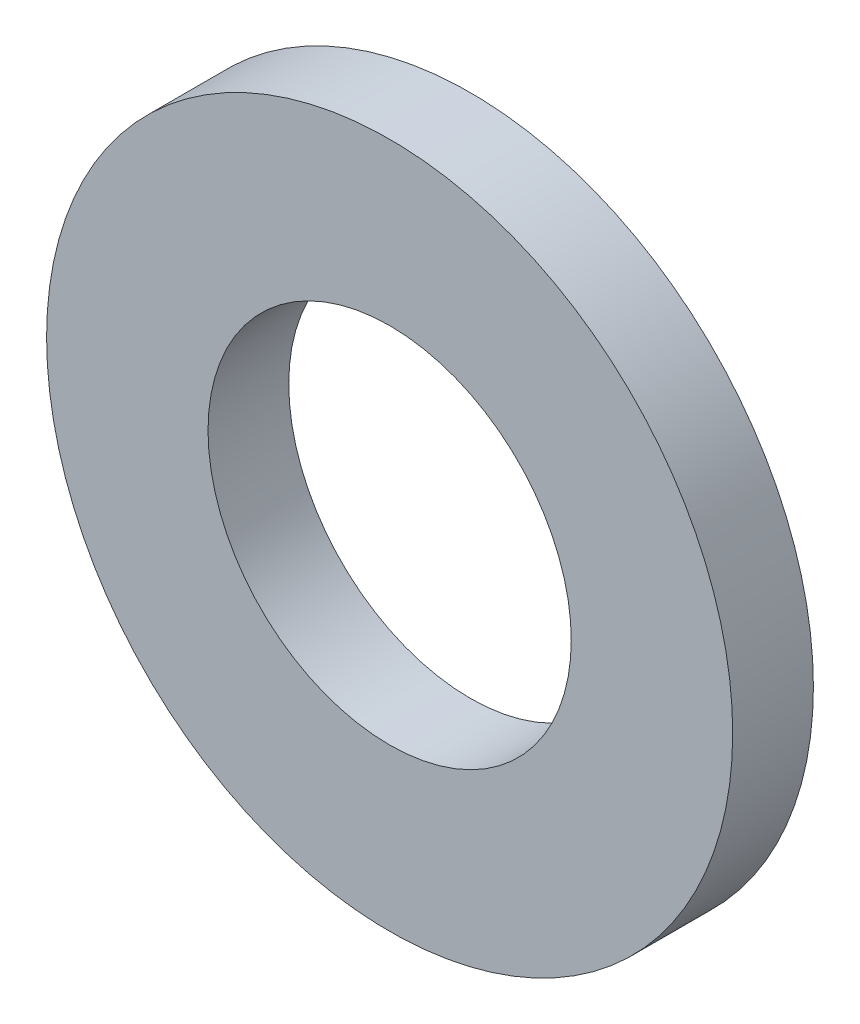
ISO-10303-21;
HEADER;
FILE_DESCRIPTION(('STEP AP214'),'2;1');
FILE_NAME('part.step','',(''),(''),'','','');
FILE_SCHEMA(('AUTOMOTIVE_DESIGN { 1 0 10303 214 1 1 1 1 }'));
ENDSEC;
DATA;
#1=APPLICATION_CONTEXT('core data for automotive mechanical design processes');
#2=APPLICATION_PROTOCOL_DEFINITION('international standard','automotive_design',2000,#1);
#3=PRODUCT_CONTEXT('',#1,'mechanical');
#4=PRODUCT('Part','Part','',(#3));
#5=PRODUCT_RELATED_PRODUCT_CATEGORY('part','',(#4));
#6=PRODUCT_DEFINITION_FORMATION('','',#4);
#7=PRODUCT_DEFINITION_CONTEXT('part definition',#1,'design');
#8=PRODUCT_DEFINITION('design','',#6,#7);
#9=PRODUCT_DEFINITION_SHAPE('','',#8);
#10=(LENGTH_UNIT() NAMED_UNIT(*) SI_UNIT(.MILLI.,.METRE.));
#11=(NAMED_UNIT(*) PLANE_ANGLE_UNIT() SI_UNIT($,.RADIAN.));
#12=(NAMED_UNIT(*) SI_UNIT($,.STERADIAN.) SOLID_ANGLE_UNIT());
#13=UNCERTAINTY_MEASURE_WITH_UNIT(LENGTH_MEASURE(1.E-05),#10,'distance_accuracy_value','');
#14=(GEOMETRIC_REPRESENTATION_CONTEXT(3) GLOBAL_UNCERTAINTY_ASSIGNED_CONTEXT((#13)) GLOBAL_UNIT_ASSIGNED_CONTEXT((#10,
#11,#12)) REPRESENTATION_CONTEXT('',''));
#15=CARTESIAN_POINT('',(0.,0.,0.));
#16=DIRECTION('',(0.,0.,1.));
#17=DIRECTION('',(1.,0.,0.));
#18=AXIS2_PLACEMENT_3D('',#15,#16,#17);
#19=CARTESIAN_POINT('',(0.,0.,10.));
#20=DIRECTION('',(0.,0.,1.));
#21=DIRECTION('',(1.,0.,0.));
#22=AXIS2_PLACEMENT_3D('',#19,#20,#21);
#23=PLANE('',#22);
#24=CARTESIAN_POINT('',(0.,0.,10.));
#25=DIRECTION('',(0.,0.,1.));
#26=DIRECTION('',(1.,0.,0.));
#27=AXIS2_PLACEMENT_3D('',#24,#25,#26);
#28=CIRCLE('',#27,42.5);
#29=CARTESIAN_POINT('',(42.5,0.,10.));
#30=VERTEX_POINT('',#29);
#31=EDGE_CURVE('E12',#30,#30,#28,.T.);
#32=ORIENTED_EDGE('',*,*,#31,.T.);
#33=EDGE_LOOP('',(#32));
#34=FACE_BOUND('',#33,.T.);
#35=CARTESIAN_POINT('',(0.,0.,10.));
#36=DIRECTION('',(0.,0.,1.));
#37=DIRECTION('',(1.,0.,0.));
#38=AXIS2_PLACEMENT_3D('',#35,#36,#37);
#39=CIRCLE('',#38,22.5);
#40=CARTESIAN_POINT('',(22.5,0.,10.));
#41=VERTEX_POINT('',#40);
#42=EDGE_CURVE('E51',#41,#41,#39,.T.);
#43=ORIENTED_EDGE('',*,*,#42,.F.);
#44=EDGE_LOOP('',(#43));
#45=FACE_BOUND('',#44,.T.);
#46=ADVANCED_FACE('F40',(#34,#45),#23,.T.);
#47=CARTESIAN_POINT('',(0.,0.,0.));
#48=DIRECTION('',(0.,0.,1.));
#49=DIRECTION('',(1.,0.,0.));
#50=AXIS2_PLACEMENT_3D('',#47,#48,#49);
#51=PLANE('',#50);
#52=CARTESIAN_POINT('',(0.,0.,0.));
#53=DIRECTION('',(0.,0.,1.));
#54=DIRECTION('',(1.,0.,0.));
#55=AXIS2_PLACEMENT_3D('',#52,#53,#54);
#56=CIRCLE('',#55,42.5);
#57=CARTESIAN_POINT('',(42.5,0.,0.));
#58=VERTEX_POINT('',#57);
#59=EDGE_CURVE('E44',#58,#58,#56,.T.);
#60=ORIENTED_EDGE('',*,*,#59,.F.);
#61=EDGE_LOOP('',(#60));
#62=FACE_BOUND('',#61,.T.);
#63=CARTESIAN_POINT('',(0.,0.,0.));
#64=DIRECTION('',(0.,0.,1.));
#65=DIRECTION('',(1.,0.,0.));
#66=AXIS2_PLACEMENT_3D('',#63,#64,#65);
#67=CIRCLE('',#66,22.5);
#68=CARTESIAN_POINT('',(22.5,0.,0.));
#69=VERTEX_POINT('',#68);
#70=EDGE_CURVE('E53',#69,#69,#67,.T.);
#71=ORIENTED_EDGE('',*,*,#70,.T.);
#72=EDGE_LOOP('',(#71));
#73=FACE_BOUND('',#72,.T.);
#74=ADVANCED_FACE('F63',(#62,#73),#51,.F.);
#75=CARTESIAN_POINT('',(0.,0.,10.));
#76=DIRECTION('',(0.,0.,-1.));
#77=DIRECTION('',(-1.,0.,0.));
#78=AXIS2_PLACEMENT_3D('',#75,#76,#77);
#79=CYLINDRICAL_SURFACE('',#78,42.5);
#80=ORIENTED_EDGE('',*,*,#31,.F.);
#81=EDGE_LOOP('',(#80));
#82=FACE_BOUND('',#81,.T.);
#83=ORIENTED_EDGE('',*,*,#59,.T.);
#84=EDGE_LOOP('',(#83));
#85=FACE_BOUND('',#84,.T.);
#86=ADVANCED_FACE('F42',(#82,#85),#79,.T.);
#87=CARTESIAN_POINT('',(0.,0.,10.));
#88=DIRECTION('',(0.,0.,-1.));
#89=DIRECTION('',(-1.,0.,0.));
#90=AXIS2_PLACEMENT_3D('',#87,#88,#89);
#91=CYLINDRICAL_SURFACE('',#90,22.5);
#92=ORIENTED_EDGE('',*,*,#42,.T.);
#93=EDGE_LOOP('',(#92));
#94=FACE_BOUND('',#93,.T.);
#95=ORIENTED_EDGE('',*,*,#70,.F.);
#96=EDGE_LOOP('',(#95));
#97=FACE_BOUND('',#96,.T.);
#98=ADVANCED_FACE('F59',(#94,#97),#91,.F.);
#99=CLOSED_SHELL('',(#46,#74,#86,#98));
#100=MANIFOLD_SOLID_BREP('B2',#99);
#101=ADVANCED_BREP_SHAPE_REPRESENTATION('',(#18,#100),#14);
#102=SHAPE_DEFINITION_REPRESENTATION(#9,#101);
ENDSEC;
END-ISO-10303-21;
